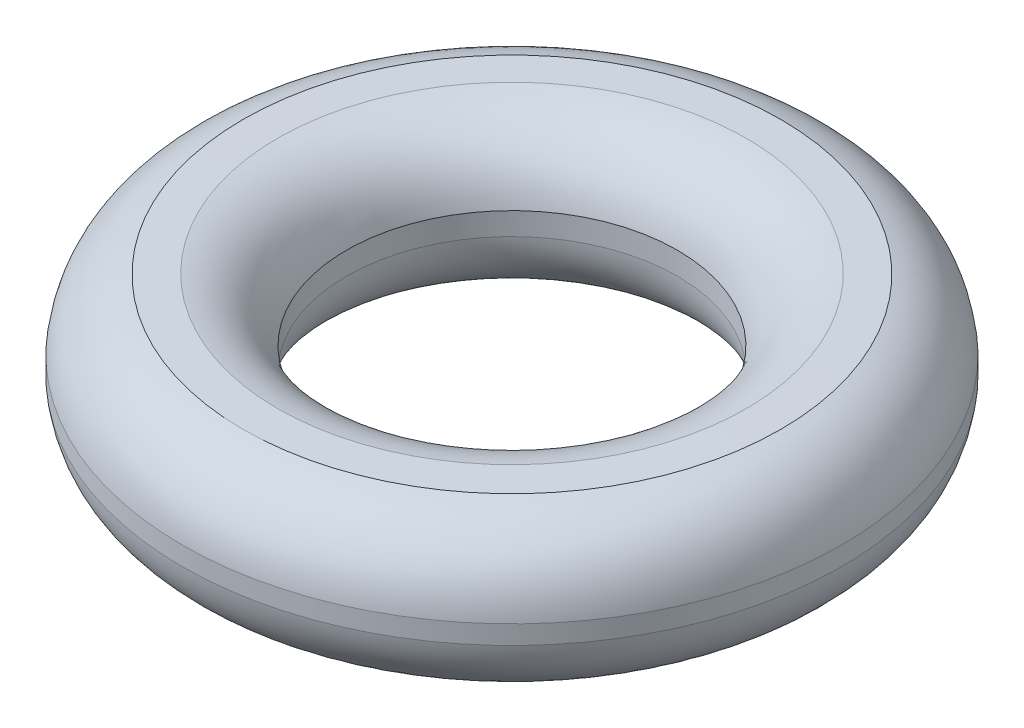
ISO-10303-21;
HEADER;
FILE_DESCRIPTION(('STEP AP214'),'2;1');
FILE_NAME('part.step','',(''),(''),'','','');
FILE_SCHEMA(('AUTOMOTIVE_DESIGN { 1 0 10303 214 1 1 1 1 }'));
ENDSEC;
DATA;
#1=APPLICATION_CONTEXT('core data for automotive mechanical design processes');
#2=APPLICATION_PROTOCOL_DEFINITION('international standard','automotive_design',2000,#1);
#3=PRODUCT_CONTEXT('',#1,'mechanical');
#4=PRODUCT('Part','Part','',(#3));
#5=PRODUCT_RELATED_PRODUCT_CATEGORY('part','',(#4));
#6=PRODUCT_DEFINITION_FORMATION('','',#4);
#7=PRODUCT_DEFINITION_CONTEXT('part definition',#1,'design');
#8=PRODUCT_DEFINITION('design','',#6,#7);
#9=PRODUCT_DEFINITION_SHAPE('','',#8);
#10=(LENGTH_UNIT() NAMED_UNIT(*) SI_UNIT(.MILLI.,.METRE.));
#11=(NAMED_UNIT(*) PLANE_ANGLE_UNIT() SI_UNIT($,.RADIAN.));
#12=(NAMED_UNIT(*) SI_UNIT($,.STERADIAN.) SOLID_ANGLE_UNIT());
#13=UNCERTAINTY_MEASURE_WITH_UNIT(LENGTH_MEASURE(1.E-05),#10,'distance_accuracy_value','');
#14=(GEOMETRIC_REPRESENTATION_CONTEXT(3) GLOBAL_UNCERTAINTY_ASSIGNED_CONTEXT((#13)) GLOBAL_UNIT_ASSIGNED_CONTEXT((#10,
#11,#12)) REPRESENTATION_CONTEXT('',''));
#15=CARTESIAN_POINT('',(0.,0.,0.));
#16=DIRECTION('',(0.,0.,1.));
#17=DIRECTION('',(1.,0.,0.));
#18=AXIS2_PLACEMENT_3D('',#15,#16,#17);
#19=CARTESIAN_POINT('',(95.5012198331601,37.1816855282207,0.));
#20=CARTESIAN_POINT('',(95.4794618468182,36.8544377148062,0.));
#21=CARTESIAN_POINT('',(95.4570200055038,36.5273351095182,0.));
#22=CARTESIAN_POINT('',(95.3983446955912,35.8760583800403,0.));
#23=CARTESIAN_POINT('',(95.3637480219221,35.5515367027363,0.));
#24=CARTESIAN_POINT('',(95.2435962833525,34.5814458787352,0.));
#25=CARTESIAN_POINT('',(95.1416937540123,33.939347913475,0.));
#26=CARTESIAN_POINT('',(94.7654581769067,32.0280297619391,0.));
#27=CARTESIAN_POINT('',(94.4209990894991,30.7736999709263,0.));
#28=CARTESIAN_POINT('',(93.7379258795782,28.9275349872786,0.));
#29=CARTESIAN_POINT('',(93.4824965107554,28.3194211538392,0.));
#30=CARTESIAN_POINT('',(92.9245027140295,27.1416847635176,0.));
#31=CARTESIAN_POINT('',(92.6208183902122,26.5688255286568,0.));
#32=CARTESIAN_POINT('',(91.6350513855108,24.8986973472681,0.));
#33=CARTESIAN_POINT('',(90.8785400295377,23.8496928788196,0.));
#34=CARTESIAN_POINT('',(89.5877335302568,22.3773724910251,0.));
#35=CARTESIAN_POINT('',(89.1285522467691,21.9010533756359,0.));
#36=CARTESIAN_POINT('',(88.1749497427719,21.0006103844199,0.));
#37=CARTESIAN_POINT('',(87.6800240358124,20.5752993401414,0.));
#38=CARTESIAN_POINT('',(86.1437547687633,19.3701375824334,0.));
#39=CARTESIAN_POINT('',(85.0510431332035,18.6608877199891,0.));
#40=CARTESIAN_POINT('',(83.3174059145988,17.7269906575124,0.));
#41=CARTESIAN_POINT('',(82.7248717092078,17.4382547876895,0.));
#42=CARTESIAN_POINT('',(81.5276020631505,16.9094638487029,0.));
#43=CARTESIAN_POINT('',(80.9207453344503,16.6682312466155,0.));
#44=CARTESIAN_POINT('',(79.6920704220983,16.2279156621377,0.));
#45=CARTESIAN_POINT('',(79.0702501059277,16.028838687509,0.));
#46=CARTESIAN_POINT('',(77.8129202527568,15.6692502022243,0.));
#47=CARTESIAN_POINT('',(77.1758922441926,15.5130165508506,0.));
#48=CARTESIAN_POINT('',(76.5406292889668,15.3518103665782,0.));
#49=B_SPLINE_CURVE_WITH_KNOTS('',3,(#19,#20,#21,#22,#23,#24,#25,#26,#27,#28,#29,#30,#31,#32,#33,
#34,#35,#36,#37,#38,#39,#40,#41,#42,#43,#44,#45,#46,#47,#48),.UNSPECIFIED.,.F.,.F.,(4,2,2,2,2,2,
2,2,2,2,2,2,2,2,4),(0.,0.0312500000000005,0.062500000000001,0.125000000000002,0.250000000000003,
0.312500000000003,0.375000000000004,0.500000000000004,0.562500000000004,0.625000000000004,
0.750000000000003,0.812500000000002,0.875000000000001,0.937500000000001,1.),.UNSPECIFIED.);
#50=CARTESIAN_POINT('',(147.03598274787,78.5813716856841,0.));
#51=DIRECTION('',(0.,1.,0.));
#52=AXIS1_PLACEMENT('',#50,#51);
#53=SURFACE_OF_REVOLUTION('',#49,#52);
#54=CARTESIAN_POINT('',(147.03598274787,37.1816855282207,0.));
#55=DIRECTION('',(0.,1.,0.));
#56=DIRECTION('',(0.,0.,1.));
#57=AXIS2_PLACEMENT_3D('',#54,#55,#56);
#58=CIRCLE('',#57,51.5347629147096);
#59=CARTESIAN_POINT('',(147.03598274787,37.1816855282207,51.5347629147096));
#60=VERTEX_POINT('',#59);
#61=EDGE_CURVE('E48',#60,#60,#58,.T.);
#62=ORIENTED_EDGE('',*,*,#61,.T.);
#63=EDGE_LOOP('',(#62));
#64=FACE_BOUND('',#63,.T.);
#65=CARTESIAN_POINT('',(146.183624040184,15.3518103665782,-70.4902003396861));
#66=CARTESIAN_POINT('',(146.096495801939,15.3681356704576,-70.4247834940965));
#67=CARTESIAN_POINT('',(146.006560197366,15.383482562456,-70.3628564174755));
#68=CARTESIAN_POINT('',(145.821691090244,15.4121458578971,-70.2464239124634));
#69=CARTESIAN_POINT('',(145.726757227408,15.4254621146962,-70.1919190200994));
#70=CARTESIAN_POINT('',(145.532517213065,15.4499885995857,-70.0907804924195));
#71=CARTESIAN_POINT('',(145.433210882382,15.4611987412715,-70.0441471800472));
#72=CARTESIAN_POINT('',(145.2309150606,15.4814193396853,-69.9591319860222));
#73=CARTESIAN_POINT('',(145.127925740771,15.4904298985474,-69.9207497212552));
#74=CARTESIAN_POINT('',(144.918887505825,15.5061680589505,-69.852522211211));
#75=CARTESIAN_POINT('',(144.812836052517,15.5128937039482,-69.8226842857623));
#76=CARTESIAN_POINT('',(144.598476689658,15.5239746087507,-69.7718285847571));
#77=CARTESIAN_POINT('',(144.490167954599,15.5283289849875,-69.7508140976044));
#78=CARTESIAN_POINT('',(144.272204240393,15.5346035386073,-69.7178144230509));
#79=CARTESIAN_POINT('',(144.162550537331,15.5365258665739,-69.7058212621866));
#80=CARTESIAN_POINT('',(143.942600971284,15.5379204607832,-69.6909216883579));
#81=CARTESIAN_POINT('',(143.832304895642,15.5373918634767,-69.6880184787137));
#82=CARTESIAN_POINT('',(143.504485420458,15.532169192253,-69.6929779295115));
#83=CARTESIAN_POINT('',(143.287065067184,15.5239221176166,-69.7140665866435));
#84=CARTESIAN_POINT('',(142.859133145764,15.4982653262151,-69.7911554452736));
#85=CARTESIAN_POINT('',(142.648621328435,15.480855940311,-69.8471543861369));
#86=CARTESIAN_POINT('',(142.309108254933,15.4449000637164,-69.967636141028));
#87=CARTESIAN_POINT('',(142.176515107573,15.4287074456202,-70.0229234867048));
#88=CARTESIAN_POINT('',(141.918663268983,15.3928317444857,-70.1470288689422));
#89=CARTESIAN_POINT('',(141.793389795145,15.3731560444517,-70.2158183183279));
#90=CARTESIAN_POINT('',(141.672336257828,15.3518103665782,-70.2910104894326));
#91=B_SPLINE_CURVE_WITH_KNOTS('',3,(#65,#66,#67,#68,#69,#70,#71,#72,#73,#74,#75,#76,#77,#78,#79,
#80,#81,#82,#83,#84,#85,#86,#87,#88,#89,#90),.UNSPECIFIED.,.F.,.F.,(4,2,2,2,2,2,2,2,2,2,2,2,4),
(0.,0.33041745169311,0.660858753366215,0.991313608606807,1.32175311678756,1.65247486721892,
1.98331976504063,2.31387190221051,2.64454051363658,3.29699505311846,3.94942603337366,
4.38231739486441,4.81430192066936),.UNSPECIFIED.);
#92=CARTESIAN_POINT('',(146.183624040184,15.3518103665782,-70.4902003396861));
#93=VERTEX_POINT('',#92);
#94=CARTESIAN_POINT('',(141.672336257828,15.3518103665782,-70.2910104894325));
#95=VERTEX_POINT('',#94);
#96=EDGE_CURVE('E62',#93,#95,#91,.T.);
#97=ORIENTED_EDGE('',*,*,#96,.F.);
#98=CARTESIAN_POINT('',(147.03598274787,15.3518103665782,0.));
#99=DIRECTION('',(0.,1.,0.));
#100=DIRECTION('',(0.,0.,1.));
#101=AXIS2_PLACEMENT_3D('',#98,#99,#100);
#102=CIRCLE('',#101,70.4953534589029);
#103=EDGE_CURVE('E72',#95,#93,#102,.T.);
#104=ORIENTED_EDGE('',*,*,#103,.F.);
#105=EDGE_LOOP('',(#97,#104));
#106=FACE_BOUND('',#105,.T.);
#107=ADVANCED_FACE('F39',(#64,#106),#53,.T.);
#108=CARTESIAN_POINT('',(0.,15.3518103665782,0.));
#109=DIRECTION('',(0.,-1.,0.));
#110=DIRECTION('',(0.,0.,-1.));
#111=AXIS2_PLACEMENT_3D('',#108,#109,#110);
#112=PLANE('',#111);
#113=CARTESIAN_POINT('',(147.03598274787,15.3518103665782,0.));
#114=DIRECTION('',(0.,1.,0.));
#115=DIRECTION('',(0.,0.,1.));
#116=AXIS2_PLACEMENT_3D('',#113,#114,#115);
#117=CIRCLE('',#116,82.322338766194);
#118=CARTESIAN_POINT('',(147.03598274787,15.3518103665782,82.322338766194));
#119=VERTEX_POINT('',#118);
#120=EDGE_CURVE('E76',#119,#119,#117,.T.);
#121=ORIENTED_EDGE('',*,*,#120,.F.);
#122=EDGE_LOOP('',(#121));
#123=FACE_BOUND('',#122,.T.);
#124=ORIENTED_EDGE('',*,*,#103,.T.);
#125=CARTESIAN_POINT('',(143.782333716071,15.3518103665782,-73.68923219));
#126=DIRECTION('',(0.,-1.,0.));
#127=DIRECTION('',(0.,0.,-1.));
#128=AXIS2_PLACEMENT_3D('',#125,#126,#127);
#129=CIRCLE('',#128,3.99999999999999);
#130=EDGE_CURVE('E67',#93,#95,#129,.F.);
#131=ORIENTED_EDGE('',*,*,#130,.T.);
#132=EDGE_LOOP('',(#124,#131));
#133=FACE_BOUND('',#132,.T.);
#134=ADVANCED_FACE('F80',(#123,#133),#112,.T.);
#135=CARTESIAN_POINT('',(74.079002390159,63.676695531624,0.));
#136=CARTESIAN_POINT('',(74.398348906422,63.6227914986971,0.));
#137=CARTESIAN_POINT('',(74.7180575508301,63.5701883794032,0.));
#138=CARTESIAN_POINT('',(75.3556905456933,63.4585722211218,0.));
#139=CARTESIAN_POINT('',(75.6732491145232,63.3982451436932,0.));
#140=CARTESIAN_POINT('',(76.622009578133,63.2031987443997,0.));
#141=CARTESIAN_POINT('',(77.2492995061425,63.0544260246611,0.));
#142=CARTESIAN_POINT('',(79.1142811518728,62.5474387082748,0.));
#143=CARTESIAN_POINT('',(80.3351689225259,62.1288574040756,0.));
#144=CARTESIAN_POINT('',(82.7238977693939,61.101129193631,0.));
#145=CARTESIAN_POINT('',(83.8664699121763,60.5023713691286,0.));
#146=CARTESIAN_POINT('',(86.0350216760901,59.1292002850904,0.));
#147=CARTESIAN_POINT('',(87.0622592694143,58.3543843951579,0.));
#148=CARTESIAN_POINT('',(88.5105185104873,57.0489255709169,0.));
#149=CARTESIAN_POINT('',(88.973958417852,56.5930306171343,0.));
#150=CARTESIAN_POINT('',(89.853374624792,55.6504651218533,0.));
#151=CARTESIAN_POINT('',(90.2709692146477,55.1623535594387,0.));
#152=CARTESIAN_POINT('',(91.4593606270329,53.6490150336015,0.));
#153=CARTESIAN_POINT('',(92.1658954471698,52.5748834341207,0.));
#154=CARTESIAN_POINT('',(93.1019350323576,50.8695002503475,0.));
#155=CARTESIAN_POINT('',(93.3924505715741,50.286384911596,0.));
#156=CARTESIAN_POINT('',(93.9255052089522,49.1079028461984,0.));
#157=CARTESIAN_POINT('',(94.1692651495661,48.5103831802942,0.));
#158=CARTESIAN_POINT('',(94.6145364730174,47.2999815036374,0.));
#159=CARTESIAN_POINT('',(94.8160431825269,46.6870977935776,0.));
#160=CARTESIAN_POINT('',(95.1796529596107,45.4470024918082,0.));
#161=CARTESIAN_POINT('',(95.337725816175,44.8183254419953,0.));
#162=CARTESIAN_POINT('',(95.5012198331601,44.1916196248172,0.));
#163=B_SPLINE_CURVE_WITH_KNOTS('',3,(#135,#136,#137,#138,#139,#140,#141,#142,#143,#144,#145,
#146,#147,#148,#149,#150,#151,#152,#153,#154,#155,#156,#157,#158,#159,#160,#161,#162),
.UNSPECIFIED.,.F.,.F.,(4,2,2,2,2,2,2,2,2,2,2,2,2,4),(0.,0.0312500000000001,0.0625000000000002,
0.125,0.25,0.375,0.5,0.5625,0.625,0.749999999999999,0.8125,0.875,0.9375,1.),.UNSPECIFIED.);
#164=CARTESIAN_POINT('',(147.03598274787,78.5813716856841,0.));
#165=DIRECTION('',(0.,1.,0.));
#166=AXIS1_PLACEMENT('',#164,#165);
#167=SURFACE_OF_REVOLUTION('',#163,#166);
#168=CARTESIAN_POINT('',(147.03598274787,44.1916196248172,0.));
#169=DIRECTION('',(0.,1.,0.));
#170=DIRECTION('',(0.,0.,1.));
#171=AXIS2_PLACEMENT_3D('',#168,#169,#170);
#172=CIRCLE('',#171,51.5347629147096);
#173=CARTESIAN_POINT('',(147.03598274787,44.1916196248172,51.5347629147096));
#174=VERTEX_POINT('',#173);
#175=EDGE_CURVE('E11',#174,#174,#172,.T.);
#176=ORIENTED_EDGE('',*,*,#175,.F.);
#177=EDGE_LOOP('',(#176));
#178=FACE_BOUND('',#177,.T.);
#179=CARTESIAN_POINT('',(147.03598274787,63.676695531624,0.));
#180=DIRECTION('',(0.,1.,0.));
#181=DIRECTION('',(0.,0.,1.));
#182=AXIS2_PLACEMENT_3D('',#179,#180,#181);
#183=CIRCLE('',#182,72.9569803577107);
#184=CARTESIAN_POINT('',(147.03598274787,63.676695531624,72.9569803577107));
#185=VERTEX_POINT('',#184);
#186=EDGE_CURVE('E93',#185,#185,#183,.T.);
#187=ORIENTED_EDGE('',*,*,#186,.T.);
#188=EDGE_LOOP('',(#187));
#189=FACE_BOUND('',#188,.T.);
#190=ADVANCED_FACE('F41',(#178,#189),#167,.T.);
#191=CARTESIAN_POINT('',(147.03598274787,78.5813716856841,0.));
#192=DIRECTION('',(0.,1.,0.));
#193=DIRECTION('',(0.,0.,1.));
#194=AXIS2_PLACEMENT_3D('',#191,#192,#193);
#195=CYLINDRICAL_SURFACE('',#194,51.5347629147096);
#196=ORIENTED_EDGE('',*,*,#61,.F.);
#197=EDGE_LOOP('',(#196));
#198=FACE_BOUND('',#197,.T.);
#199=ORIENTED_EDGE('',*,*,#175,.T.);
#200=EDGE_LOOP('',(#199));
#201=FACE_BOUND('',#200,.T.);
#202=ADVANCED_FACE('F124',(#198,#201),#195,.F.);
#203=CARTESIAN_POINT('',(44.390442816458,35.9101038548965,0.));
#204=CARTESIAN_POINT('',(44.4358022575491,35.5861884871638,0.));
#205=CARTESIAN_POINT('',(44.4795694264,35.2618132178418,0.));
#206=CARTESIAN_POINT('',(44.579291866641,34.6165830117056,0.));
#207=CARTESIAN_POINT('',(44.6344017639155,34.2954839025134,0.));
#208=CARTESIAN_POINT('',(44.8160245287529,33.3368925604992,0.));
#209=CARTESIAN_POINT('',(44.9588173608132,32.7041025270607,0.));
#210=CARTESIAN_POINT('',(45.4571129299369,30.8259268207407,0.));
#211=CARTESIAN_POINT('',(45.8821584469434,29.6006274334913,0.));
#212=CARTESIAN_POINT('',(46.6831728604859,27.8098870753157,0.));
#213=CARTESIAN_POINT('',(46.9786718116212,27.2193675261717,0.));
#214=CARTESIAN_POINT('',(47.6155671185419,26.0786754160019,0.));
#215=CARTESIAN_POINT('',(47.9580360321911,25.5256839676172,0.));
#216=CARTESIAN_POINT('',(49.0582252732026,23.9192926948473,0.));
#217=CARTESIAN_POINT('',(49.8884451491872,22.9182715193087,0.));
#218=CARTESIAN_POINT('',(51.2862252345512,21.5268802931943,0.));
#219=CARTESIAN_POINT('',(51.7726925498416,21.0866160759935,0.));
#220=CARTESIAN_POINT('',(52.7777057619433,20.257478029585,0.));
#221=CARTESIAN_POINT('',(53.2973777081278,19.8674836965738,0.));
#222=CARTESIAN_POINT('',(54.3695626961726,19.1345118531451,0.));
#223=CARTESIAN_POINT('',(54.9220795113112,18.7915397447264,0.));
#224=CARTESIAN_POINT('',(56.0587951385095,18.1509529314109,0.));
#225=CARTESIAN_POINT('',(56.645429680121,17.8522770792147,0.));
#226=CARTESIAN_POINT('',(58.4319520339133,17.0309096178305,0.));
#227=CARTESIAN_POINT('',(59.6538155612564,16.5833329711965,0.));
#228=CARTESIAN_POINT('',(61.5248718288215,16.0359982044649,0.));
#229=CARTESIAN_POINT('',(62.1549631451136,15.8743192003382,0.));
#230=CARTESIAN_POINT('',(63.1089108824994,15.6603624512558,0.));
#231=CARTESIAN_POINT('',(63.4283630376559,15.5938074439696,0.));
#232=CARTESIAN_POINT('',(64.0700854711809,15.4698329096221,0.));
#233=CARTESIAN_POINT('',(64.3920837697002,15.4115317083591,0.));
#234=CARTESIAN_POINT('',(64.7136439816757,15.3518103665782,0.));
#235=B_SPLINE_CURVE_WITH_KNOTS('',3,(#203,#204,#205,#206,#207,#208,#209,#210,#211,#212,#213,
#214,#215,#216,#217,#218,#219,#220,#221,#222,#223,#224,#225,#226,#227,#228,#229,#230,#231,#232,
#233,#234),.UNSPECIFIED.,.F.,.F.,(4,2,2,2,2,2,2,2,2,2,2,2,2,2,2,4),(0.,0.0312499999999999,
0.0624999999999998,0.125,0.249999999999999,0.312499999999999,0.374999999999999,
0.499999999999999,0.562499999999999,0.624999999999999,0.687499999999999,0.749999999999999,
0.874999999999999,0.937499999999999,0.96875,1.),.UNSPECIFIED.);
#236=CARTESIAN_POINT('',(147.03598274787,78.5813716856841,0.));
#237=DIRECTION('',(0.,1.,0.));
#238=AXIS1_PLACEMENT('',#236,#237);
#239=SURFACE_OF_REVOLUTION('',#235,#238);
#240=ORIENTED_EDGE('',*,*,#120,.T.);
#241=EDGE_LOOP('',(#240));
#242=FACE_BOUND('',#241,.T.);
#243=CARTESIAN_POINT('',(147.03598274787,35.9101038548965,0.));
#244=DIRECTION('',(0.,1.,0.));
#245=DIRECTION('',(0.,0.,1.));
#246=AXIS2_PLACEMENT_3D('',#243,#244,#245);
#247=CIRCLE('',#246,102.645539931412);
#248=CARTESIAN_POINT('',(147.03598274787,35.9101038548965,102.645539931412));
#249=VERTEX_POINT('',#248);
#250=EDGE_CURVE('E85',#249,#249,#247,.T.);
#251=ORIENTED_EDGE('',*,*,#250,.F.);
#252=EDGE_LOOP('',(#251));
#253=FACE_BOUND('',#252,.T.);
#254=ADVANCED_FACE('F118',(#242,#253),#239,.F.);
#255=CARTESIAN_POINT('',(147.03598274787,78.5813716856841,0.));
#256=DIRECTION('',(0.,1.,0.));
#257=DIRECTION('',(0.,0.,1.));
#258=AXIS2_PLACEMENT_3D('',#255,#256,#257);
#259=CYLINDRICAL_SURFACE('',#258,102.645539931412);
#260=CARTESIAN_POINT('',(147.03598274787,41.7425670673918,0.));
#261=DIRECTION('',(0.,1.,0.));
#262=DIRECTION('',(0.,0.,1.));
#263=AXIS2_PLACEMENT_3D('',#260,#261,#262);
#264=CIRCLE('',#263,102.645539931412);
#265=CARTESIAN_POINT('',(147.03598274787,41.7425670673918,102.645539931412));
#266=VERTEX_POINT('',#265);
#267=EDGE_CURVE('E89',#266,#266,#264,.T.);
#268=ORIENTED_EDGE('',*,*,#267,.F.);
#269=EDGE_LOOP('',(#268));
#270=FACE_BOUND('',#269,.T.);
#271=ORIENTED_EDGE('',*,*,#250,.T.);
#272=EDGE_LOOP('',(#271));
#273=FACE_BOUND('',#272,.T.);
#274=ADVANCED_FACE('F112',(#270,#273),#259,.T.);
#275=CARTESIAN_POINT('',(44.390442816458,41.7425670673918,0.));
#276=CARTESIAN_POINT('',(44.4318903643903,42.0627458495255,0.));
#277=CARTESIAN_POINT('',(44.4720244803651,42.3832576188468,0.));
#278=CARTESIAN_POINT('',(44.5636613853128,43.0213989202897,0.));
#279=CARTESIAN_POINT('',(44.6141909247756,43.3392751950122,0.));
#280=CARTESIAN_POINT('',(44.7804192122047,44.289192504326,0.));
#281=CARTESIAN_POINT('',(44.9107459684459,44.9175249803536,0.));
#282=CARTESIAN_POINT('',(45.3646730158964,46.7865638574897,0.));
#283=CARTESIAN_POINT('',(45.7509127894625,48.0113896148117,0.));
#284=CARTESIAN_POINT('',(46.4776816676815,49.8112564017347,0.));
#285=CARTESIAN_POINT('',(46.7435279692874,50.4018100230802,0.));
#286=CARTESIAN_POINT('',(47.3178348952669,51.5505900221161,0.));
#287=CARTESIAN_POINT('',(47.6270649769398,52.1107812774829,0.));
#288=CARTESIAN_POINT('',(48.622295502993,53.7479160013977,0.));
#289=CARTESIAN_POINT('',(49.3756121649521,54.7815645358646,0.));
#290=CARTESIAN_POINT('',(50.6489082248067,56.2398593102229,0.));
#291=CARTESIAN_POINT('',(51.0983129978877,56.7111039838213,0.));
#292=CARTESIAN_POINT('',(52.0269370249564,57.6037695402885,0.));
#293=CARTESIAN_POINT('',(52.5082032283972,58.0277367144636,0.));
#294=CARTESIAN_POINT('',(54.0008808916908,59.2351580376079,0.));
#295=CARTESIAN_POINT('',(55.0610692843184,59.9542667019712,0.));
#296=CARTESIAN_POINT('',(56.743482340327,60.9113931603786,0.));
#297=CARTESIAN_POINT('',(57.3205274706131,61.2103361517255,0.));
#298=CARTESIAN_POINT('',(58.4874871847275,61.7611906626763,0.));
#299=CARTESIAN_POINT('',(59.0793910371925,62.0143320453828,0.));
#300=CARTESIAN_POINT('',(60.2787418354172,62.4794952015322,0.));
#301=CARTESIAN_POINT('',(60.8861905955093,62.6915121751173,0.));
#302=CARTESIAN_POINT('',(62.1155028018457,63.0774117399611,0.));
#303=CARTESIAN_POINT('',(62.738893624369,63.2472536222955,0.));
#304=CARTESIAN_POINT('',(63.3603476355362,63.4222193834273,0.));
#305=B_SPLINE_CURVE_WITH_KNOTS('',3,(#275,#276,#277,#278,#279,#280,#281,#282,#283,#284,#285,
#286,#287,#288,#289,#290,#291,#292,#293,#294,#295,#296,#297,#298,#299,#300,#301,#302,#303,#304),
.UNSPECIFIED.,.F.,.F.,(4,2,2,2,2,2,2,2,2,2,2,2,2,2,4),(0.,0.0312500000000004,0.0625000000000008,
0.125000000000001,0.250000000000001,0.312500000000001,0.375000000000001,0.5,0.5625,0.625,0.75,
0.8125,0.875,0.9375,1.),.UNSPECIFIED.);
#306=CARTESIAN_POINT('',(147.03598274787,78.5813716856841,0.));
#307=DIRECTION('',(0.,1.,0.));
#308=AXIS1_PLACEMENT('',#306,#307);
#309=SURFACE_OF_REVOLUTION('',#305,#308);
#310=CARTESIAN_POINT('',(147.03598274787,63.4222193834273,0.));
#311=DIRECTION('',(0.,1.,0.));
#312=DIRECTION('',(0.,0.,1.));
#313=AXIS2_PLACEMENT_3D('',#310,#311,#312);
#314=CIRCLE('',#313,83.6756351123335);
#315=CARTESIAN_POINT('',(147.03598274787,63.4222193834273,83.6756351123335));
#316=VERTEX_POINT('',#315);
#317=EDGE_CURVE('E88',#316,#316,#314,.T.);
#318=ORIENTED_EDGE('',*,*,#317,.F.);
#319=EDGE_LOOP('',(#318));
#320=FACE_BOUND('',#319,.T.);
#321=ORIENTED_EDGE('',*,*,#267,.T.);
#322=EDGE_LOOP('',(#321));
#323=FACE_BOUND('',#322,.T.);
#324=ADVANCED_FACE('F107',(#320,#323),#309,.T.);
#325=CARTESIAN_POINT('',(147.03598274787,63.4222193834273,0.));
#326=DIRECTION('',(0.,-1.,0.));
#327=DIRECTION('',(0.,0.,-1.));
#328=AXIS2_PLACEMENT_3D('',#325,#326,#327);
#329=CONICAL_SURFACE('',#328,83.6756351123335,1.54705935999194);
#330=ORIENTED_EDGE('',*,*,#186,.F.);
#331=EDGE_LOOP('',(#330));
#332=FACE_BOUND('',#331,.T.);
#333=ORIENTED_EDGE('',*,*,#317,.T.);
#334=EDGE_LOOP('',(#333));
#335=FACE_BOUND('',#334,.T.);
#336=ADVANCED_FACE('F113',(#332,#335),#329,.T.);
#337=CARTESIAN_POINT('',(143.782333716071,23.3518103665782,-73.68923219));
#338=DIRECTION('',(0.,1.,0.));
#339=DIRECTION('',(0.,0.,1.));
#340=AXIS2_PLACEMENT_3D('',#337,#338,#339);
#341=PLANE('',#340);
#342=CARTESIAN_POINT('',(143.782333716071,23.3518103665782,-73.68923219));
#343=DIRECTION('',(0.,1.,0.));
#344=DIRECTION('',(0.,0.,1.));
#345=AXIS2_PLACEMENT_3D('',#342,#343,#344);
#346=CIRCLE('',#345,3.99999999999999);
#347=CARTESIAN_POINT('',(140.644650054949,23.3518103665782,-71.208316785815));
#348=VERTEX_POINT('',#347);
#349=CARTESIAN_POINT('',(147.126463759504,23.3518103665782,-71.4945125603855));
#350=VERTEX_POINT('',#349);
#351=EDGE_CURVE('E53',#348,#350,#346,.T.);
#352=ORIENTED_EDGE('',*,*,#351,.F.);
#353=CARTESIAN_POINT('',(147.03598274787,23.3518103665782,0.));
#354=DIRECTION('',(0.,1.,0.));
#355=DIRECTION('',(0.,0.,1.));
#356=AXIS2_PLACEMENT_3D('',#353,#354,#355);
#357=CIRCLE('',#356,71.4945698152005);
#358=EDGE_CURVE('E160',#350,#348,#357,.T.);
#359=ORIENTED_EDGE('',*,*,#358,.F.);
#360=EDGE_LOOP('',(#352,#359));
#361=FACE_BOUND('',#360,.T.);
#362=ADVANCED_FACE('F259',(#361),#341,.F.);
#363=CARTESIAN_POINT('',(143.782333716071,15.3508103665782,-73.68923219));
#364=DIRECTION('',(0.,1.,0.));
#365=DIRECTION('',(0.,0.,1.));
#366=AXIS2_PLACEMENT_3D('',#363,#364,#365);
#367=CYLINDRICAL_SURFACE('',#366,3.99999999999999);
#368=EDGE_CURVE('E71',#350,#348,#346,.T.);
#369=ORIENTED_EDGE('',*,*,#368,.T.);
#370=ORIENTED_EDGE('',*,*,#351,.T.);
#371=EDGE_LOOP('',(#369,#370));
#372=FACE_BOUND('',#371,.T.);
#373=ORIENTED_EDGE('',*,*,#96,.T.);
#374=ORIENTED_EDGE('',*,*,#130,.F.);
#375=EDGE_LOOP('',(#373,#374));
#376=FACE_BOUND('',#375,.T.);
#377=ADVANCED_FACE('F69',(#372,#376),#367,.F.);
#378=CARTESIAN_POINT('',(73.5029444350679,55.6607647907295,0.));
#379=CARTESIAN_POINT('',(84.7360675995469,53.7646719571002,0.));
#380=CARTESIAN_POINT('',(87.5012198331601,43.1652810916489,0.));
#381=B_SPLINE_CURVE_WITH_KNOTS('',2,(#378,#379,#380),.UNSPECIFIED.,.F.,.F.,(3,3),(0.,1.),.UNSPECIFIED.);
#382=CARTESIAN_POINT('',(147.03598274787,78.5813716856841,0.));
#383=DIRECTION('',(0.,1.,0.));
#384=AXIS1_PLACEMENT('',#382,#383);
#385=SURFACE_OF_REVOLUTION('',#381,#384);
#386=CARTESIAN_POINT('',(147.03598274787,43.1652810916489,0.));
#387=DIRECTION('',(0.,1.,0.));
#388=DIRECTION('',(0.,0.,1.));
#389=AXIS2_PLACEMENT_3D('',#386,#387,#388);
#390=CIRCLE('',#389,59.5347629147096);
#391=CARTESIAN_POINT('',(147.03598274787,43.1652810916489,59.5347629147096));
#392=VERTEX_POINT('',#391);
#393=EDGE_CURVE('E74',#392,#392,#390,.T.);
#394=ORIENTED_EDGE('',*,*,#393,.T.);
#395=EDGE_LOOP('',(#394));
#396=FACE_BOUND('',#395,.T.);
#397=CARTESIAN_POINT('',(147.03598274787,55.6607647907295,0.));
#398=DIRECTION('',(0.,1.,0.));
#399=DIRECTION('',(0.,0.,1.));
#400=AXIS2_PLACEMENT_3D('',#397,#398,#399);
#401=CIRCLE('',#400,73.5330383128017);
#402=CARTESIAN_POINT('',(147.03598274787,55.6607647907295,73.5330383128017));
#403=VERTEX_POINT('',#402);
#404=EDGE_CURVE('E98',#403,#403,#401,.T.);
#405=ORIENTED_EDGE('',*,*,#404,.F.);
#406=EDGE_LOOP('',(#405));
#407=FACE_BOUND('',#406,.T.);
#408=ADVANCED_FACE('F190',(#396,#407),#385,.F.);
#409=CARTESIAN_POINT('',(147.03598274787,55.4483998486103,0.));
#410=DIRECTION('',(0.,-1.,0.));
#411=DIRECTION('',(0.,0.,-1.));
#412=AXIS2_PLACEMENT_3D('',#409,#410,#411);
#413=CONICAL_SURFACE('',#412,82.4779493101291,1.54705935999194);
#414=ORIENTED_EDGE('',*,*,#404,.T.);
#415=EDGE_LOOP('',(#414));
#416=FACE_BOUND('',#415,.T.);
#417=CARTESIAN_POINT('',(147.03598274787,55.4483998486103,0.));
#418=DIRECTION('',(0.,1.,0.));
#419=DIRECTION('',(0.,0.,1.));
#420=AXIS2_PLACEMENT_3D('',#417,#418,#419);
#421=CIRCLE('',#420,82.4779493101291);
#422=CARTESIAN_POINT('',(147.03598274787,55.4483998486103,82.4779493101291));
#423=VERTEX_POINT('',#422);
#424=EDGE_CURVE('E143',#423,#423,#421,.T.);
#425=ORIENTED_EDGE('',*,*,#424,.F.);
#426=EDGE_LOOP('',(#425));
#427=FACE_BOUND('',#426,.T.);
#428=ADVANCED_FACE('F182',(#416,#427),#413,.F.);
#429=CARTESIAN_POINT('',(52.390442816458,41.2269133212667,0.));
#430=CARTESIAN_POINT('',(53.8408326708581,52.4310515723328,0.));
#431=CARTESIAN_POINT('',(64.5580334377405,55.4483998486103,0.));
#432=B_SPLINE_CURVE_WITH_KNOTS('',2,(#429,#430,#431),.UNSPECIFIED.,.F.,.F.,(3,3),(0.,1.),.UNSPECIFIED.);
#433=CARTESIAN_POINT('',(147.03598274787,78.5813716856841,0.));
#434=DIRECTION('',(0.,1.,0.));
#435=AXIS1_PLACEMENT('',#433,#434);
#436=SURFACE_OF_REVOLUTION('',#432,#435);
#437=ORIENTED_EDGE('',*,*,#424,.T.);
#438=EDGE_LOOP('',(#437));
#439=FACE_BOUND('',#438,.T.);
#440=CARTESIAN_POINT('',(147.03598274787,41.2269133212667,0.));
#441=DIRECTION('',(0.,1.,0.));
#442=DIRECTION('',(0.,0.,1.));
#443=AXIS2_PLACEMENT_3D('',#440,#441,#442);
#444=CIRCLE('',#443,94.6455399314116);
#445=CARTESIAN_POINT('',(147.03598274787,41.2269133212667,94.6455399314116));
#446=VERTEX_POINT('',#445);
#447=EDGE_CURVE('E149',#446,#446,#444,.T.);
#448=ORIENTED_EDGE('',*,*,#447,.F.);
#449=EDGE_LOOP('',(#448));
#450=FACE_BOUND('',#449,.T.);
#451=ADVANCED_FACE('F178',(#439,#450),#436,.F.);
#452=CARTESIAN_POINT('',(147.03598274787,78.5813716856841,0.));
#453=DIRECTION('',(0.,1.,0.));
#454=DIRECTION('',(0.,0.,1.));
#455=AXIS2_PLACEMENT_3D('',#452,#453,#454);
#456=CYLINDRICAL_SURFACE('',#455,94.6455399314116);
#457=ORIENTED_EDGE('',*,*,#447,.T.);
#458=EDGE_LOOP('',(#457));
#459=FACE_BOUND('',#458,.T.);
#460=CARTESIAN_POINT('',(147.03598274787,36.4675238184581,0.));
#461=DIRECTION('',(0.,1.,0.));
#462=DIRECTION('',(0.,0.,1.));
#463=AXIS2_PLACEMENT_3D('',#460,#461,#462);
#464=CIRCLE('',#463,94.6455399314116);
#465=CARTESIAN_POINT('',(147.03598274787,36.4675238184581,94.6455399314116));
#466=VERTEX_POINT('',#465);
#467=EDGE_CURVE('E152',#466,#466,#464,.T.);
#468=ORIENTED_EDGE('',*,*,#467,.F.);
#469=EDGE_LOOP('',(#468));
#470=FACE_BOUND('',#469,.T.);
#471=ADVANCED_FACE('F185',(#459,#470),#456,.F.);
#472=CARTESIAN_POINT('',(52.390442816458,36.4675238184581,0.));
#473=CARTESIAN_POINT('',(53.9274166847571,25.4918714786153,0.));
#474=CARTESIAN_POINT('',(65.4502405916866,23.3518103665782,0.));
#475=B_SPLINE_CURVE_WITH_KNOTS('',2,(#472,#473,#474),.UNSPECIFIED.,.F.,.F.,(3,3),(0.,1.),.UNSPECIFIED.);
#476=CARTESIAN_POINT('',(147.03598274787,78.5813716856841,0.));
#477=DIRECTION('',(0.,1.,0.));
#478=AXIS1_PLACEMENT('',#476,#477);
#479=SURFACE_OF_REVOLUTION('',#475,#478);
#480=CARTESIAN_POINT('',(147.03598274787,23.3518103665782,0.));
#481=DIRECTION('',(0.,1.,0.));
#482=DIRECTION('',(0.,0.,1.));
#483=AXIS2_PLACEMENT_3D('',#480,#481,#482);
#484=CIRCLE('',#483,81.5857421561831);
#485=CARTESIAN_POINT('',(147.03598274787,23.3518103665782,81.5857421561831));
#486=VERTEX_POINT('',#485);
#487=EDGE_CURVE('E151',#486,#486,#484,.T.);
#488=ORIENTED_EDGE('',*,*,#487,.F.);
#489=EDGE_LOOP('',(#488));
#490=FACE_BOUND('',#489,.T.);
#491=ORIENTED_EDGE('',*,*,#467,.T.);
#492=EDGE_LOOP('',(#491));
#493=FACE_BOUND('',#492,.T.);
#494=ADVANCED_FACE('F216',(#490,#493),#479,.T.);
#495=CARTESIAN_POINT('',(0.,23.3518103665782,0.));
#496=DIRECTION('',(0.,-1.,0.));
#497=DIRECTION('',(0.,0.,-1.));
#498=AXIS2_PLACEMENT_3D('',#495,#496,#497);
#499=PLANE('',#498);
#500=ORIENTED_EDGE('',*,*,#368,.F.);
#501=EDGE_CURVE('E159',#348,#350,#357,.T.);
#502=ORIENTED_EDGE('',*,*,#501,.F.);
#503=EDGE_LOOP('',(#500,#502));
#504=FACE_BOUND('',#503,.T.);
#505=ORIENTED_EDGE('',*,*,#487,.T.);
#506=EDGE_LOOP('',(#505));
#507=FACE_BOUND('',#506,.T.);
#508=ADVANCED_FACE('F217',(#504,#507),#499,.F.);
#509=CARTESIAN_POINT('',(87.5012198331601,37.4473434482086,0.));
#510=CARTESIAN_POINT('',(86.7532057987739,26.1969476942454,0.));
#511=CARTESIAN_POINT('',(75.5414129326691,23.3518103665782,0.));
#512=B_SPLINE_CURVE_WITH_KNOTS('',2,(#509,#510,#511),.UNSPECIFIED.,.F.,.F.,(3,3),(0.,1.),.UNSPECIFIED.);
#513=CARTESIAN_POINT('',(147.03598274787,78.5813716856841,0.));
#514=DIRECTION('',(0.,1.,0.));
#515=AXIS1_PLACEMENT('',#513,#514);
#516=SURFACE_OF_REVOLUTION('',#512,#515);
#517=ORIENTED_EDGE('',*,*,#358,.T.);
#518=ORIENTED_EDGE('',*,*,#501,.T.);
#519=EDGE_LOOP('',(#517,#518));
#520=FACE_BOUND('',#519,.T.);
#521=CARTESIAN_POINT('',(147.03598274787,37.4473434482086,0.));
#522=DIRECTION('',(0.,1.,0.));
#523=DIRECTION('',(0.,0.,1.));
#524=AXIS2_PLACEMENT_3D('',#521,#522,#523);
#525=CIRCLE('',#524,59.5347629147096);
#526=CARTESIAN_POINT('',(147.03598274787,37.4473434482086,59.5347629147096));
#527=VERTEX_POINT('',#526);
#528=EDGE_CURVE('E163',#527,#527,#525,.T.);
#529=ORIENTED_EDGE('',*,*,#528,.F.);
#530=EDGE_LOOP('',(#529));
#531=FACE_BOUND('',#530,.T.);
#532=ADVANCED_FACE('F212',(#520,#531),#516,.F.);
#533=CARTESIAN_POINT('',(147.03598274787,78.5813716856841,0.));
#534=DIRECTION('',(0.,1.,0.));
#535=DIRECTION('',(0.,0.,1.));
#536=AXIS2_PLACEMENT_3D('',#533,#534,#535);
#537=CYLINDRICAL_SURFACE('',#536,59.5347629147096);
#538=ORIENTED_EDGE('',*,*,#528,.T.);
#539=EDGE_LOOP('',(#538));
#540=FACE_BOUND('',#539,.T.);
#541=ORIENTED_EDGE('',*,*,#393,.F.);
#542=EDGE_LOOP('',(#541));
#543=FACE_BOUND('',#542,.T.);
#544=ADVANCED_FACE('F213',(#540,#543),#537,.T.);
#545=CLOSED_SHELL('',(#107,#134,#190,#202,#254,#274,#324,#336,#362,#377,#408,#428,#451,#471,
#494,#508,#532,#544));
#546=MANIFOLD_SOLID_BREP('B2',#545);
#547=ADVANCED_BREP_SHAPE_REPRESENTATION('',(#18,#546),#14);
#548=SHAPE_DEFINITION_REPRESENTATION(#9,#547);
ENDSEC;
END-ISO-10303-21;
